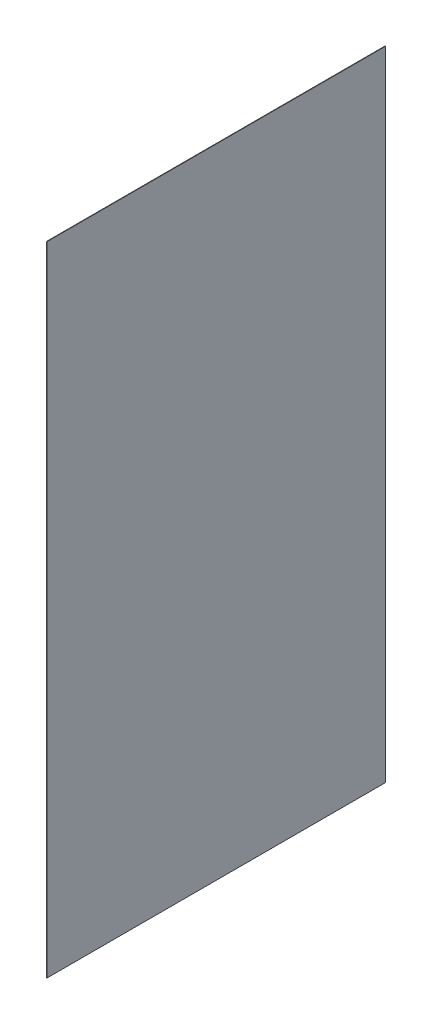
ISO-10303-21;
HEADER;
FILE_DESCRIPTION(('STEP AP214'),'2;1');
FILE_NAME('part.step','',(''),(''),'','','');
FILE_SCHEMA(('AUTOMOTIVE_DESIGN { 1 0 10303 214 1 1 1 1 }'));
ENDSEC;
DATA;
#1=APPLICATION_CONTEXT('core data for automotive mechanical design processes');
#2=APPLICATION_PROTOCOL_DEFINITION('international standard','automotive_design',2000,#1);
#3=PRODUCT_CONTEXT('',#1,'mechanical');
#4=PRODUCT('Part','Part','',(#3));
#5=PRODUCT_RELATED_PRODUCT_CATEGORY('part','',(#4));
#6=PRODUCT_DEFINITION_FORMATION('','',#4);
#7=PRODUCT_DEFINITION_CONTEXT('part definition',#1,'design');
#8=PRODUCT_DEFINITION('design','',#6,#7);
#9=PRODUCT_DEFINITION_SHAPE('','',#8);
#10=(LENGTH_UNIT() NAMED_UNIT(*) SI_UNIT(.MILLI.,.METRE.));
#11=(NAMED_UNIT(*) PLANE_ANGLE_UNIT() SI_UNIT($,.RADIAN.));
#12=(NAMED_UNIT(*) SI_UNIT($,.STERADIAN.) SOLID_ANGLE_UNIT());
#13=UNCERTAINTY_MEASURE_WITH_UNIT(LENGTH_MEASURE(1.E-05),#10,'distance_accuracy_value','');
#14=(GEOMETRIC_REPRESENTATION_CONTEXT(3) GLOBAL_UNCERTAINTY_ASSIGNED_CONTEXT((#13)) GLOBAL_UNIT_ASSIGNED_CONTEXT((#10,
#11,#12)) REPRESENTATION_CONTEXT('',''));
#15=CARTESIAN_POINT('',(0.,0.,0.));
#16=DIRECTION('',(0.,0.,1.));
#17=DIRECTION('',(1.,0.,0.));
#18=AXIS2_PLACEMENT_3D('',#15,#16,#17);
#19=CARTESIAN_POINT('',(61.5,181.5,-758.5));
#20=DIRECTION('',(-1.,0.,0.));
#21=DIRECTION('',(0.,0.,1.));
#22=AXIS2_PLACEMENT_3D('',#19,#20,#21);
#23=PLANE('',#22);
#24=DIRECTION('',(0.,-1.,0.));
#25=VECTOR('',#24,1.);
#26=CARTESIAN_POINT('',(61.5,181.5,0.));
#27=LINE('',#26,#25);
#28=CARTESIAN_POINT('',(61.5,1611.,0.));
#29=VERTEX_POINT('',#28);
#30=CARTESIAN_POINT('',(61.5,181.5,0.));
#31=VERTEX_POINT('',#30);
#32=EDGE_CURVE('E103',#29,#31,#27,.T.);
#33=ORIENTED_EDGE('',*,*,#32,.F.);
#34=DIRECTION('',(0.,0.,1.));
#35=VECTOR('',#34,1.);
#36=CARTESIAN_POINT('',(61.5,1611.,-758.5));
#37=LINE('',#36,#35);
#38=CARTESIAN_POINT('',(61.5,1611.,-758.5));
#39=VERTEX_POINT('',#38);
#40=EDGE_CURVE('E11',#39,#29,#37,.T.);
#41=ORIENTED_EDGE('',*,*,#40,.F.);
#42=DIRECTION('',(0.,-1.,0.));
#43=VECTOR('',#42,1.);
#44=CARTESIAN_POINT('',(61.5,181.5,-758.5));
#45=LINE('',#44,#43);
#46=CARTESIAN_POINT('',(61.5,181.5,-758.5));
#47=VERTEX_POINT('',#46);
#48=EDGE_CURVE('E97',#39,#47,#45,.T.);
#49=ORIENTED_EDGE('',*,*,#48,.T.);
#50=DIRECTION('',(0.,0.,1.));
#51=VECTOR('',#50,1.);
#52=CARTESIAN_POINT('',(61.5,181.5,-758.5));
#53=LINE('',#52,#51);
#54=EDGE_CURVE('E42',#47,#31,#53,.T.);
#55=ORIENTED_EDGE('',*,*,#54,.T.);
#56=EDGE_LOOP('',(#33,#41,#49,#55));
#57=FACE_BOUND('',#56,.T.);
#58=ADVANCED_FACE('F39',(#57),#23,.T.);
#59=CARTESIAN_POINT('',(61.5,1611.,-758.5));
#60=DIRECTION('',(0.,1.,0.));
#61=DIRECTION('',(0.,0.,1.));
#62=AXIS2_PLACEMENT_3D('',#59,#60,#61);
#63=PLANE('',#62);
#64=DIRECTION('',(-1.,0.,0.));
#65=VECTOR('',#64,1.);
#66=CARTESIAN_POINT('',(61.5,1611.,0.));
#67=LINE('',#66,#65);
#68=CARTESIAN_POINT('',(62.5,1611.,0.));
#69=VERTEX_POINT('',#68);
#70=EDGE_CURVE('E99',#69,#29,#67,.T.);
#71=ORIENTED_EDGE('',*,*,#70,.F.);
#72=DIRECTION('',(0.,0.,1.));
#73=VECTOR('',#72,1.);
#74=CARTESIAN_POINT('',(62.5,1611.,-758.5));
#75=LINE('',#74,#73);
#76=CARTESIAN_POINT('',(62.5,1611.,-758.5));
#77=VERTEX_POINT('',#76);
#78=EDGE_CURVE('E48',#77,#69,#75,.T.);
#79=ORIENTED_EDGE('',*,*,#78,.F.);
#80=DIRECTION('',(-1.,0.,0.));
#81=VECTOR('',#80,1.);
#82=CARTESIAN_POINT('',(61.5,1611.,-758.5));
#83=LINE('',#82,#81);
#84=EDGE_CURVE('E94',#77,#39,#83,.T.);
#85=ORIENTED_EDGE('',*,*,#84,.T.);
#86=ORIENTED_EDGE('',*,*,#40,.T.);
#87=EDGE_LOOP('',(#71,#79,#85,#86));
#88=FACE_BOUND('',#87,.T.);
#89=ADVANCED_FACE('F113',(#88),#63,.T.);
#90=CARTESIAN_POINT('',(62.5,181.5,-758.5));
#91=DIRECTION('',(1.,0.,0.));
#92=DIRECTION('',(0.,0.,-1.));
#93=AXIS2_PLACEMENT_3D('',#90,#91,#92);
#94=PLANE('',#93);
#95=DIRECTION('',(0.,1.,0.));
#96=VECTOR('',#95,1.);
#97=CARTESIAN_POINT('',(62.5,181.5,0.));
#98=LINE('',#97,#96);
#99=CARTESIAN_POINT('',(62.5,181.5,0.));
#100=VERTEX_POINT('',#99);
#101=EDGE_CURVE('E89',#100,#69,#98,.T.);
#102=ORIENTED_EDGE('',*,*,#101,.F.);
#103=DIRECTION('',(0.,0.,1.));
#104=VECTOR('',#103,1.);
#105=CARTESIAN_POINT('',(62.5,181.5,-758.5));
#106=LINE('',#105,#104);
#107=CARTESIAN_POINT('',(62.5,181.5,-758.5));
#108=VERTEX_POINT('',#107);
#109=EDGE_CURVE('E84',#108,#100,#106,.T.);
#110=ORIENTED_EDGE('',*,*,#109,.F.);
#111=DIRECTION('',(0.,1.,0.));
#112=VECTOR('',#111,1.);
#113=CARTESIAN_POINT('',(62.5,181.5,-758.5));
#114=LINE('',#113,#112);
#115=EDGE_CURVE('E87',#108,#77,#114,.T.);
#116=ORIENTED_EDGE('',*,*,#115,.T.);
#117=ORIENTED_EDGE('',*,*,#78,.T.);
#118=EDGE_LOOP('',(#102,#110,#116,#117));
#119=FACE_BOUND('',#118,.T.);
#120=ADVANCED_FACE('F86',(#119),#94,.T.);
#121=CARTESIAN_POINT('',(61.5,181.5,-758.5));
#122=DIRECTION('',(0.,-1.,0.));
#123=DIRECTION('',(0.,0.,-1.));
#124=AXIS2_PLACEMENT_3D('',#121,#122,#123);
#125=PLANE('',#124);
#126=DIRECTION('',(1.,0.,0.));
#127=VECTOR('',#126,1.);
#128=CARTESIAN_POINT('',(61.5,181.5,0.));
#129=LINE('',#128,#127);
#130=EDGE_CURVE('E106',#31,#100,#129,.T.);
#131=ORIENTED_EDGE('',*,*,#130,.F.);
#132=ORIENTED_EDGE('',*,*,#54,.F.);
#133=DIRECTION('',(1.,0.,0.));
#134=VECTOR('',#133,1.);
#135=CARTESIAN_POINT('',(61.5,181.5,-758.5));
#136=LINE('',#135,#134);
#137=EDGE_CURVE('E93',#47,#108,#136,.T.);
#138=ORIENTED_EDGE('',*,*,#137,.T.);
#139=ORIENTED_EDGE('',*,*,#109,.T.);
#140=EDGE_LOOP('',(#131,#132,#138,#139));
#141=FACE_BOUND('',#140,.T.);
#142=ADVANCED_FACE('F96',(#141),#125,.T.);
#143=CARTESIAN_POINT('',(0.,0.,-758.5));
#144=DIRECTION('',(0.,0.,-1.));
#145=DIRECTION('',(-1.,0.,0.));
#146=AXIS2_PLACEMENT_3D('',#143,#144,#145);
#147=PLANE('',#146);
#148=ORIENTED_EDGE('',*,*,#48,.F.);
#149=ORIENTED_EDGE('',*,*,#84,.F.);
#150=ORIENTED_EDGE('',*,*,#115,.F.);
#151=ORIENTED_EDGE('',*,*,#137,.F.);
#152=EDGE_LOOP('',(#148,#149,#150,#151));
#153=FACE_BOUND('',#152,.T.);
#154=ADVANCED_FACE('F92',(#153),#147,.T.);
#155=CARTESIAN_POINT('',(0.,0.,0.));
#156=DIRECTION('',(0.,0.,-1.));
#157=DIRECTION('',(-1.,0.,0.));
#158=AXIS2_PLACEMENT_3D('',#155,#156,#157);
#159=PLANE('',#158);
#160=ORIENTED_EDGE('',*,*,#32,.T.);
#161=ORIENTED_EDGE('',*,*,#130,.T.);
#162=ORIENTED_EDGE('',*,*,#101,.T.);
#163=ORIENTED_EDGE('',*,*,#70,.T.);
#164=EDGE_LOOP('',(#160,#161,#162,#163));
#165=FACE_BOUND('',#164,.T.);
#166=ADVANCED_FACE('F112',(#165),#159,.F.);
#167=CLOSED_SHELL('',(#58,#89,#120,#142,#154,#166));
#168=MANIFOLD_SOLID_BREP('B2',#167);
#169=ADVANCED_BREP_SHAPE_REPRESENTATION('',(#18,#168),#14);
#170=SHAPE_DEFINITION_REPRESENTATION(#9,#169);
ENDSEC;
END-ISO-10303-21;
